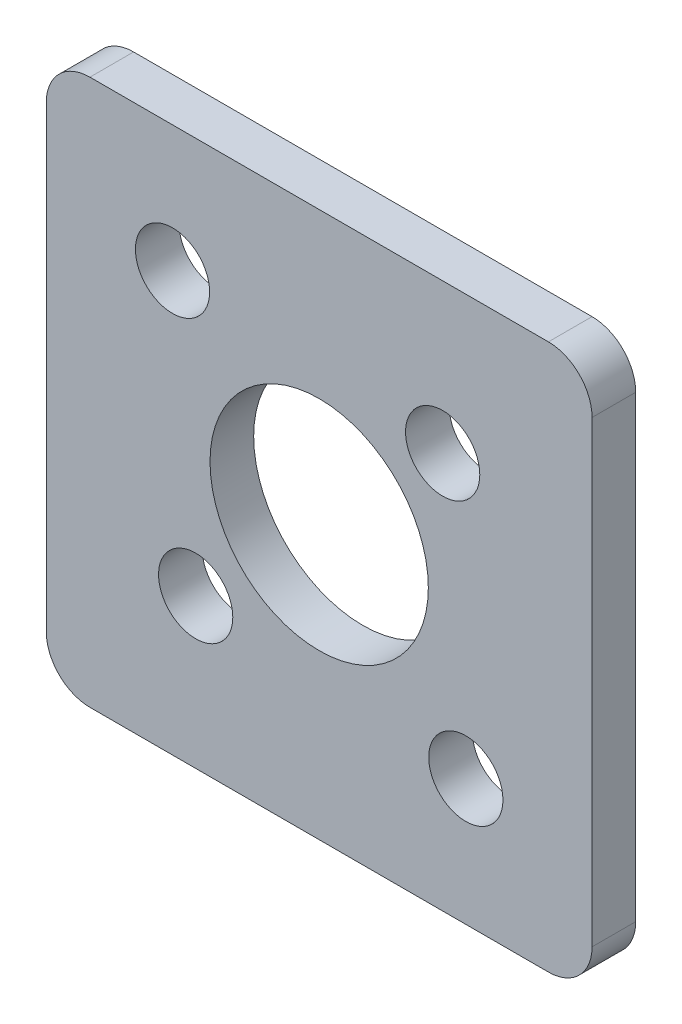
ISO-10303-21;
HEADER;
FILE_DESCRIPTION(('STEP AP214'),'2;1');
FILE_NAME('part.step','',(''),(''),'','','');
FILE_SCHEMA(('AUTOMOTIVE_DESIGN { 1 0 10303 214 1 1 1 1 }'));
ENDSEC;
DATA;
#1=APPLICATION_CONTEXT('core data for automotive mechanical design processes');
#2=APPLICATION_PROTOCOL_DEFINITION('international standard','automotive_design',2000,#1);
#3=PRODUCT_CONTEXT('',#1,'mechanical');
#4=PRODUCT('Part','Part','',(#3));
#5=PRODUCT_RELATED_PRODUCT_CATEGORY('part','',(#4));
#6=PRODUCT_DEFINITION_FORMATION('','',#4);
#7=PRODUCT_DEFINITION_CONTEXT('part definition',#1,'design');
#8=PRODUCT_DEFINITION('design','',#6,#7);
#9=PRODUCT_DEFINITION_SHAPE('','',#8);
#10=(LENGTH_UNIT() NAMED_UNIT(*) SI_UNIT(.MILLI.,.METRE.));
#11=(NAMED_UNIT(*) PLANE_ANGLE_UNIT() SI_UNIT($,.RADIAN.));
#12=(NAMED_UNIT(*) SI_UNIT($,.STERADIAN.) SOLID_ANGLE_UNIT());
#13=UNCERTAINTY_MEASURE_WITH_UNIT(LENGTH_MEASURE(1.E-05),#10,'distance_accuracy_value','');
#14=(GEOMETRIC_REPRESENTATION_CONTEXT(3) GLOBAL_UNCERTAINTY_ASSIGNED_CONTEXT((#13)) GLOBAL_UNIT_ASSIGNED_CONTEXT((#10,
#11,#12)) REPRESENTATION_CONTEXT('',''));
#15=CARTESIAN_POINT('',(0.,0.,0.));
#16=DIRECTION('',(0.,0.,1.));
#17=DIRECTION('',(1.,0.,0.));
#18=AXIS2_PLACEMENT_3D('',#15,#16,#17);
#19=CARTESIAN_POINT('',(0.,0.,2.));
#20=DIRECTION('',(0.,0.,-1.));
#21=DIRECTION('',(-1.,0.,0.));
#22=AXIS2_PLACEMENT_3D('',#19,#20,#21);
#23=PLANE('',#22);
#24=CARTESIAN_POINT('',(-6.7175144212722,6.71751442127219,2.));
#25=DIRECTION('',(0.,0.,1.));
#26=DIRECTION('',(1.,0.,0.));
#27=AXIS2_PLACEMENT_3D('',#24,#25,#26);
#28=CIRCLE('',#27,1.7);
#29=CARTESIAN_POINT('',(-5.0175144212722,6.71751442127219,2.));
#30=VERTEX_POINT('',#29);
#31=EDGE_CURVE('E205',#30,#30,#28,.T.);
#32=ORIENTED_EDGE('',*,*,#31,.F.);
#33=EDGE_LOOP('',(#32));
#34=FACE_BOUND('',#33,.T.);
#35=CARTESIAN_POINT('',(5.65685424949238,5.65685424949238,2.));
#36=DIRECTION('',(0.,0.,1.));
#37=DIRECTION('',(1.,0.,0.));
#38=AXIS2_PLACEMENT_3D('',#35,#36,#37);
#39=CIRCLE('',#38,1.7);
#40=CARTESIAN_POINT('',(7.35685424949238,5.65685424949238,2.));
#41=VERTEX_POINT('',#40);
#42=EDGE_CURVE('E199',#41,#41,#39,.T.);
#43=ORIENTED_EDGE('',*,*,#42,.F.);
#44=EDGE_LOOP('',(#43));
#45=FACE_BOUND('',#44,.T.);
#46=CARTESIAN_POINT('',(6.7175144212722,-6.7175144212722,2.));
#47=DIRECTION('',(0.,0.,1.));
#48=DIRECTION('',(1.,0.,0.));
#49=AXIS2_PLACEMENT_3D('',#46,#47,#48);
#50=CIRCLE('',#49,1.7);
#51=CARTESIAN_POINT('',(8.41751442127219,-6.7175144212722,2.));
#52=VERTEX_POINT('',#51);
#53=EDGE_CURVE('E193',#52,#52,#50,.T.);
#54=ORIENTED_EDGE('',*,*,#53,.F.);
#55=EDGE_LOOP('',(#54));
#56=FACE_BOUND('',#55,.T.);
#57=CARTESIAN_POINT('',(-5.65685424949238,-5.65685424949238,2.));
#58=DIRECTION('',(0.,0.,1.));
#59=DIRECTION('',(1.,0.,0.));
#60=AXIS2_PLACEMENT_3D('',#57,#58,#59);
#61=CIRCLE('',#60,1.7);
#62=CARTESIAN_POINT('',(-3.95685424949239,-5.65685424949238,2.));
#63=VERTEX_POINT('',#62);
#64=EDGE_CURVE('E187',#63,#63,#61,.T.);
#65=ORIENTED_EDGE('',*,*,#64,.F.);
#66=EDGE_LOOP('',(#65));
#67=FACE_BOUND('',#66,.T.);
#68=DIRECTION('',(1.,0.,0.));
#69=VECTOR('',#68,1.);
#70=CARTESIAN_POINT('',(-12.5,-12.5,2.));
#71=LINE('',#70,#69);
#72=CARTESIAN_POINT('',(-10.5,-12.5,2.));
#73=VERTEX_POINT('',#72);
#74=CARTESIAN_POINT('',(10.5,-12.5,2.));
#75=VERTEX_POINT('',#74);
#76=EDGE_CURVE('E169',#73,#75,#71,.T.);
#77=ORIENTED_EDGE('',*,*,#76,.T.);
#78=CARTESIAN_POINT('',(10.5,-10.5,2.));
#79=DIRECTION('',(0.,0.,-1.));
#80=DIRECTION('',(-1.,0.,0.));
#81=AXIS2_PLACEMENT_3D('',#78,#79,#80);
#82=CIRCLE('',#81,2.);
#83=CARTESIAN_POINT('',(12.5,-10.5,2.));
#84=VERTEX_POINT('',#83);
#85=EDGE_CURVE('E147',#75,#84,#82,.F.);
#86=ORIENTED_EDGE('',*,*,#85,.T.);
#87=DIRECTION('',(0.,1.,0.));
#88=VECTOR('',#87,1.);
#89=CARTESIAN_POINT('',(12.5,-12.5,2.));
#90=LINE('',#89,#88);
#91=CARTESIAN_POINT('',(12.5,10.5,2.));
#92=VERTEX_POINT('',#91);
#93=EDGE_CURVE('E117',#84,#92,#90,.T.);
#94=ORIENTED_EDGE('',*,*,#93,.T.);
#95=CARTESIAN_POINT('',(10.5,10.5,2.));
#96=DIRECTION('',(0.,0.,-1.));
#97=DIRECTION('',(-1.,0.,0.));
#98=AXIS2_PLACEMENT_3D('',#95,#96,#97);
#99=CIRCLE('',#98,2.);
#100=CARTESIAN_POINT('',(10.5,12.5,2.));
#101=VERTEX_POINT('',#100);
#102=EDGE_CURVE('E53',#92,#101,#99,.F.);
#103=ORIENTED_EDGE('',*,*,#102,.T.);
#104=DIRECTION('',(-1.,0.,0.));
#105=VECTOR('',#104,1.);
#106=CARTESIAN_POINT('',(-12.5,12.5,2.));
#107=LINE('',#106,#105);
#108=CARTESIAN_POINT('',(-10.5,12.5,2.));
#109=VERTEX_POINT('',#108);
#110=EDGE_CURVE('E133',#101,#109,#107,.T.);
#111=ORIENTED_EDGE('',*,*,#110,.T.);
#112=CARTESIAN_POINT('',(-10.5,10.5,2.));
#113=DIRECTION('',(0.,0.,-1.));
#114=DIRECTION('',(-1.,0.,0.));
#115=AXIS2_PLACEMENT_3D('',#112,#113,#114);
#116=CIRCLE('',#115,2.);
#117=CARTESIAN_POINT('',(-12.5,10.5,2.));
#118=VERTEX_POINT('',#117);
#119=EDGE_CURVE('E143',#109,#118,#116,.F.);
#120=ORIENTED_EDGE('',*,*,#119,.T.);
#121=DIRECTION('',(0.,-1.,0.));
#122=VECTOR('',#121,1.);
#123=CARTESIAN_POINT('',(-12.5,-12.5,2.));
#124=LINE('',#123,#122);
#125=CARTESIAN_POINT('',(-12.5,-10.5,2.));
#126=VERTEX_POINT('',#125);
#127=EDGE_CURVE('E127',#118,#126,#124,.T.);
#128=ORIENTED_EDGE('',*,*,#127,.T.);
#129=CARTESIAN_POINT('',(-10.5,-10.5,2.));
#130=DIRECTION('',(0.,0.,-1.));
#131=DIRECTION('',(-1.,0.,0.));
#132=AXIS2_PLACEMENT_3D('',#129,#130,#131);
#133=CIRCLE('',#132,2.);
#134=EDGE_CURVE('E145',#126,#73,#133,.F.);
#135=ORIENTED_EDGE('',*,*,#134,.T.);
#136=EDGE_LOOP('',(#77,#86,#94,#103,#111,#120,#128,#135));
#137=FACE_BOUND('',#136,.T.);
#138=CARTESIAN_POINT('',(0.,0.,2.));
#139=DIRECTION('',(0.,0.,1.));
#140=DIRECTION('',(1.,0.,0.));
#141=AXIS2_PLACEMENT_3D('',#138,#139,#140);
#142=CIRCLE('',#141,5.);
#143=CARTESIAN_POINT('',(5.,0.,2.));
#144=VERTEX_POINT('',#143);
#145=EDGE_CURVE('E178',#144,#144,#142,.T.);
#146=ORIENTED_EDGE('',*,*,#145,.F.);
#147=EDGE_LOOP('',(#146));
#148=FACE_BOUND('',#147,.T.);
#149=ADVANCED_FACE('F33',(#34,#45,#56,#67,#137,#148),#23,.F.);
#150=CARTESIAN_POINT('',(0.,0.,0.));
#151=DIRECTION('',(0.,0.,-1.));
#152=DIRECTION('',(-1.,0.,0.));
#153=AXIS2_PLACEMENT_3D('',#150,#151,#152);
#154=PLANE('',#153);
#155=CARTESIAN_POINT('',(-6.7175144212722,6.71751442127219,0.));
#156=DIRECTION('',(0.,0.,1.));
#157=DIRECTION('',(1.,0.,0.));
#158=AXIS2_PLACEMENT_3D('',#155,#156,#157);
#159=CIRCLE('',#158,1.7);
#160=CARTESIAN_POINT('',(-5.0175144212722,6.71751442127219,0.));
#161=VERTEX_POINT('',#160);
#162=EDGE_CURVE('E202',#161,#161,#159,.T.);
#163=ORIENTED_EDGE('',*,*,#162,.T.);
#164=EDGE_LOOP('',(#163));
#165=FACE_BOUND('',#164,.T.);
#166=CARTESIAN_POINT('',(5.65685424949238,5.65685424949238,0.));
#167=DIRECTION('',(0.,0.,1.));
#168=DIRECTION('',(1.,0.,0.));
#169=AXIS2_PLACEMENT_3D('',#166,#167,#168);
#170=CIRCLE('',#169,1.7);
#171=CARTESIAN_POINT('',(7.35685424949238,5.65685424949238,0.));
#172=VERTEX_POINT('',#171);
#173=EDGE_CURVE('E196',#172,#172,#170,.T.);
#174=ORIENTED_EDGE('',*,*,#173,.T.);
#175=EDGE_LOOP('',(#174));
#176=FACE_BOUND('',#175,.T.);
#177=CARTESIAN_POINT('',(6.7175144212722,-6.7175144212722,0.));
#178=DIRECTION('',(0.,0.,1.));
#179=DIRECTION('',(1.,0.,0.));
#180=AXIS2_PLACEMENT_3D('',#177,#178,#179);
#181=CIRCLE('',#180,1.7);
#182=CARTESIAN_POINT('',(8.41751442127219,-6.7175144212722,0.));
#183=VERTEX_POINT('',#182);
#184=EDGE_CURVE('E190',#183,#183,#181,.T.);
#185=ORIENTED_EDGE('',*,*,#184,.T.);
#186=EDGE_LOOP('',(#185));
#187=FACE_BOUND('',#186,.T.);
#188=CARTESIAN_POINT('',(-5.65685424949238,-5.65685424949238,0.));
#189=DIRECTION('',(0.,0.,1.));
#190=DIRECTION('',(1.,0.,0.));
#191=AXIS2_PLACEMENT_3D('',#188,#189,#190);
#192=CIRCLE('',#191,1.7);
#193=CARTESIAN_POINT('',(-3.95685424949239,-5.65685424949238,0.));
#194=VERTEX_POINT('',#193);
#195=EDGE_CURVE('E183',#194,#194,#192,.T.);
#196=ORIENTED_EDGE('',*,*,#195,.T.);
#197=EDGE_LOOP('',(#196));
#198=FACE_BOUND('',#197,.T.);
#199=DIRECTION('',(0.,1.,0.));
#200=VECTOR('',#199,1.);
#201=CARTESIAN_POINT('',(12.5,-12.5,0.));
#202=LINE('',#201,#200);
#203=CARTESIAN_POINT('',(12.5,-10.5,0.));
#204=VERTEX_POINT('',#203);
#205=CARTESIAN_POINT('',(12.5,10.5,0.));
#206=VERTEX_POINT('',#205);
#207=EDGE_CURVE('E115',#204,#206,#202,.T.);
#208=ORIENTED_EDGE('',*,*,#207,.F.);
#209=CARTESIAN_POINT('',(10.5,-10.5,0.));
#210=DIRECTION('',(0.,0.,-1.));
#211=DIRECTION('',(-1.,0.,0.));
#212=AXIS2_PLACEMENT_3D('',#209,#210,#211);
#213=CIRCLE('',#212,2.);
#214=CARTESIAN_POINT('',(10.5,-12.5,0.));
#215=VERTEX_POINT('',#214);
#216=EDGE_CURVE('E98',#204,#215,#213,.T.);
#217=ORIENTED_EDGE('',*,*,#216,.T.);
#218=DIRECTION('',(1.,0.,0.));
#219=VECTOR('',#218,1.);
#220=CARTESIAN_POINT('',(-12.5,-12.5,0.));
#221=LINE('',#220,#219);
#222=CARTESIAN_POINT('',(-10.5,-12.5,0.));
#223=VERTEX_POINT('',#222);
#224=EDGE_CURVE('E125',#223,#215,#221,.T.);
#225=ORIENTED_EDGE('',*,*,#224,.F.);
#226=CARTESIAN_POINT('',(-10.5,-10.5,0.));
#227=DIRECTION('',(0.,0.,-1.));
#228=DIRECTION('',(-1.,0.,0.));
#229=AXIS2_PLACEMENT_3D('',#226,#227,#228);
#230=CIRCLE('',#229,2.);
#231=CARTESIAN_POINT('',(-12.5,-10.5,0.));
#232=VERTEX_POINT('',#231);
#233=EDGE_CURVE('E109',#223,#232,#230,.T.);
#234=ORIENTED_EDGE('',*,*,#233,.T.);
#235=DIRECTION('',(0.,-1.,0.));
#236=VECTOR('',#235,1.);
#237=CARTESIAN_POINT('',(-12.5,-12.5,0.));
#238=LINE('',#237,#236);
#239=CARTESIAN_POINT('',(-12.5,10.5,0.));
#240=VERTEX_POINT('',#239);
#241=EDGE_CURVE('E129',#240,#232,#238,.T.);
#242=ORIENTED_EDGE('',*,*,#241,.F.);
#243=CARTESIAN_POINT('',(-10.5,10.5,0.));
#244=DIRECTION('',(0.,0.,-1.));
#245=DIRECTION('',(-1.,0.,0.));
#246=AXIS2_PLACEMENT_3D('',#243,#244,#245);
#247=CIRCLE('',#246,2.);
#248=CARTESIAN_POINT('',(-10.5,12.5,0.));
#249=VERTEX_POINT('',#248);
#250=EDGE_CURVE('E136',#240,#249,#247,.T.);
#251=ORIENTED_EDGE('',*,*,#250,.T.);
#252=DIRECTION('',(-1.,0.,0.));
#253=VECTOR('',#252,1.);
#254=CARTESIAN_POINT('',(-12.5,12.5,0.));
#255=LINE('',#254,#253);
#256=CARTESIAN_POINT('',(10.5,12.5,0.));
#257=VERTEX_POINT('',#256);
#258=EDGE_CURVE('E124',#257,#249,#255,.T.);
#259=ORIENTED_EDGE('',*,*,#258,.F.);
#260=CARTESIAN_POINT('',(10.5,10.5,0.));
#261=DIRECTION('',(0.,0.,-1.));
#262=DIRECTION('',(-1.,0.,0.));
#263=AXIS2_PLACEMENT_3D('',#260,#261,#262);
#264=CIRCLE('',#263,2.);
#265=EDGE_CURVE('E118',#257,#206,#264,.T.);
#266=ORIENTED_EDGE('',*,*,#265,.T.);
#267=EDGE_LOOP('',(#208,#217,#225,#234,#242,#251,#259,#266));
#268=FACE_BOUND('',#267,.T.);
#269=CARTESIAN_POINT('',(0.,0.,0.));
#270=DIRECTION('',(0.,0.,1.));
#271=DIRECTION('',(1.,0.,0.));
#272=AXIS2_PLACEMENT_3D('',#269,#270,#271);
#273=CIRCLE('',#272,5.);
#274=CARTESIAN_POINT('',(5.,0.,0.));
#275=VERTEX_POINT('',#274);
#276=EDGE_CURVE('E174',#275,#275,#273,.T.);
#277=ORIENTED_EDGE('',*,*,#276,.T.);
#278=EDGE_LOOP('',(#277));
#279=FACE_BOUND('',#278,.T.);
#280=ADVANCED_FACE('F121',(#165,#176,#187,#198,#268,#279),#154,.T.);
#281=CARTESIAN_POINT('',(-12.5,-12.5,2.));
#282=DIRECTION('',(1.,0.,0.));
#283=DIRECTION('',(0.,1.,0.));
#284=AXIS2_PLACEMENT_3D('',#281,#282,#283);
#285=PLANE('',#284);
#286=ORIENTED_EDGE('',*,*,#241,.T.);
#287=DIRECTION('',(0.,0.,-1.));
#288=VECTOR('',#287,1.);
#289=CARTESIAN_POINT('',(-12.5,-10.5,2.));
#290=LINE('',#289,#288);
#291=EDGE_CURVE('E152',#232,#126,#290,.F.);
#292=ORIENTED_EDGE('',*,*,#291,.T.);
#293=ORIENTED_EDGE('',*,*,#127,.F.);
#294=DIRECTION('',(0.,0.,-1.));
#295=VECTOR('',#294,1.);
#296=CARTESIAN_POINT('',(-12.5,10.5,2.));
#297=LINE('',#296,#295);
#298=EDGE_CURVE('E149',#118,#240,#297,.T.);
#299=ORIENTED_EDGE('',*,*,#298,.T.);
#300=EDGE_LOOP('',(#286,#292,#293,#299));
#301=FACE_BOUND('',#300,.T.);
#302=ADVANCED_FACE('F165',(#301),#285,.F.);
#303=CARTESIAN_POINT('',(-12.5,-12.5,2.));
#304=DIRECTION('',(0.,1.,0.));
#305=DIRECTION('',(0.,0.,1.));
#306=AXIS2_PLACEMENT_3D('',#303,#304,#305);
#307=PLANE('',#306);
#308=ORIENTED_EDGE('',*,*,#224,.T.);
#309=DIRECTION('',(0.,0.,-1.));
#310=VECTOR('',#309,1.);
#311=CARTESIAN_POINT('',(10.5,-12.5,2.));
#312=LINE('',#311,#310);
#313=EDGE_CURVE('E103',#215,#75,#312,.F.);
#314=ORIENTED_EDGE('',*,*,#313,.T.);
#315=ORIENTED_EDGE('',*,*,#76,.F.);
#316=DIRECTION('',(0.,0.,-1.));
#317=VECTOR('',#316,1.);
#318=CARTESIAN_POINT('',(-10.5,-12.5,2.));
#319=LINE('',#318,#317);
#320=EDGE_CURVE('E108',#73,#223,#319,.T.);
#321=ORIENTED_EDGE('',*,*,#320,.T.);
#322=EDGE_LOOP('',(#308,#314,#315,#321));
#323=FACE_BOUND('',#322,.T.);
#324=ADVANCED_FACE('F223',(#323),#307,.F.);
#325=CARTESIAN_POINT('',(12.5,-12.5,2.));
#326=DIRECTION('',(-1.,0.,0.));
#327=DIRECTION('',(0.,-1.,0.));
#328=AXIS2_PLACEMENT_3D('',#325,#326,#327);
#329=PLANE('',#328);
#330=ORIENTED_EDGE('',*,*,#93,.F.);
#331=DIRECTION('',(0.,0.,-1.));
#332=VECTOR('',#331,1.);
#333=CARTESIAN_POINT('',(12.5,-10.5,2.));
#334=LINE('',#333,#332);
#335=EDGE_CURVE('E102',#84,#204,#334,.T.);
#336=ORIENTED_EDGE('',*,*,#335,.T.);
#337=ORIENTED_EDGE('',*,*,#207,.T.);
#338=DIRECTION('',(0.,0.,-1.));
#339=VECTOR('',#338,1.);
#340=CARTESIAN_POINT('',(12.5,10.5,2.));
#341=LINE('',#340,#339);
#342=EDGE_CURVE('E119',#206,#92,#341,.F.);
#343=ORIENTED_EDGE('',*,*,#342,.T.);
#344=EDGE_LOOP('',(#330,#336,#337,#343));
#345=FACE_BOUND('',#344,.T.);
#346=ADVANCED_FACE('F114',(#345),#329,.F.);
#347=CARTESIAN_POINT('',(-12.5,12.5,2.));
#348=DIRECTION('',(0.,-1.,0.));
#349=DIRECTION('',(0.,0.,-1.));
#350=AXIS2_PLACEMENT_3D('',#347,#348,#349);
#351=PLANE('',#350);
#352=ORIENTED_EDGE('',*,*,#258,.T.);
#353=DIRECTION('',(0.,0.,-1.));
#354=VECTOR('',#353,1.);
#355=CARTESIAN_POINT('',(-10.5,12.5,2.));
#356=LINE('',#355,#354);
#357=EDGE_CURVE('E11',#249,#109,#356,.F.);
#358=ORIENTED_EDGE('',*,*,#357,.T.);
#359=ORIENTED_EDGE('',*,*,#110,.F.);
#360=DIRECTION('',(0.,0.,-1.));
#361=VECTOR('',#360,1.);
#362=CARTESIAN_POINT('',(10.5,12.5,2.));
#363=LINE('',#362,#361);
#364=EDGE_CURVE('E41',#101,#257,#363,.T.);
#365=ORIENTED_EDGE('',*,*,#364,.T.);
#366=EDGE_LOOP('',(#352,#358,#359,#365));
#367=FACE_BOUND('',#366,.T.);
#368=ADVANCED_FACE('F155',(#367),#351,.F.);
#369=CARTESIAN_POINT('',(0.,0.,2.));
#370=DIRECTION('',(0.,0.,-1.));
#371=DIRECTION('',(-1.,0.,0.));
#372=AXIS2_PLACEMENT_3D('',#369,#370,#371);
#373=CYLINDRICAL_SURFACE('',#372,5.);
#374=ORIENTED_EDGE('',*,*,#145,.T.);
#375=EDGE_LOOP('',(#374));
#376=FACE_BOUND('',#375,.T.);
#377=ORIENTED_EDGE('',*,*,#276,.F.);
#378=EDGE_LOOP('',(#377));
#379=FACE_BOUND('',#378,.T.);
#380=ADVANCED_FACE('F232',(#376,#379),#373,.F.);
#381=CARTESIAN_POINT('',(10.5,-10.5,2.));
#382=DIRECTION('',(0.,0.,-1.));
#383=DIRECTION('',(-1.,0.,0.));
#384=AXIS2_PLACEMENT_3D('',#381,#382,#383);
#385=CYLINDRICAL_SURFACE('',#384,2.);
#386=ORIENTED_EDGE('',*,*,#85,.F.);
#387=ORIENTED_EDGE('',*,*,#313,.F.);
#388=ORIENTED_EDGE('',*,*,#216,.F.);
#389=ORIENTED_EDGE('',*,*,#335,.F.);
#390=EDGE_LOOP('',(#386,#387,#388,#389));
#391=FACE_BOUND('',#390,.T.);
#392=ADVANCED_FACE('F101',(#391),#385,.T.);
#393=CARTESIAN_POINT('',(-10.5,-10.5,2.));
#394=DIRECTION('',(0.,0.,-1.));
#395=DIRECTION('',(-1.,0.,0.));
#396=AXIS2_PLACEMENT_3D('',#393,#394,#395);
#397=CYLINDRICAL_SURFACE('',#396,2.);
#398=ORIENTED_EDGE('',*,*,#134,.F.);
#399=ORIENTED_EDGE('',*,*,#291,.F.);
#400=ORIENTED_EDGE('',*,*,#233,.F.);
#401=ORIENTED_EDGE('',*,*,#320,.F.);
#402=EDGE_LOOP('',(#398,#399,#400,#401));
#403=FACE_BOUND('',#402,.T.);
#404=ADVANCED_FACE('F225',(#403),#397,.T.);
#405=CARTESIAN_POINT('',(-10.5,10.5,2.));
#406=DIRECTION('',(0.,0.,-1.));
#407=DIRECTION('',(-1.,0.,0.));
#408=AXIS2_PLACEMENT_3D('',#405,#406,#407);
#409=CYLINDRICAL_SURFACE('',#408,2.);
#410=ORIENTED_EDGE('',*,*,#119,.F.);
#411=ORIENTED_EDGE('',*,*,#357,.F.);
#412=ORIENTED_EDGE('',*,*,#250,.F.);
#413=ORIENTED_EDGE('',*,*,#298,.F.);
#414=EDGE_LOOP('',(#410,#411,#412,#413));
#415=FACE_BOUND('',#414,.T.);
#416=ADVANCED_FACE('F162',(#415),#409,.T.);
#417=CARTESIAN_POINT('',(10.5,10.5,2.));
#418=DIRECTION('',(0.,0.,-1.));
#419=DIRECTION('',(-1.,0.,0.));
#420=AXIS2_PLACEMENT_3D('',#417,#418,#419);
#421=CYLINDRICAL_SURFACE('',#420,2.);
#422=ORIENTED_EDGE('',*,*,#102,.F.);
#423=ORIENTED_EDGE('',*,*,#342,.F.);
#424=ORIENTED_EDGE('',*,*,#265,.F.);
#425=ORIENTED_EDGE('',*,*,#364,.F.);
#426=EDGE_LOOP('',(#422,#423,#424,#425));
#427=FACE_BOUND('',#426,.T.);
#428=ADVANCED_FACE('F35',(#427),#421,.T.);
#429=CARTESIAN_POINT('',(-5.65685424949238,-5.65685424949238,2.));
#430=DIRECTION('',(0.,0.,1.));
#431=DIRECTION('',(1.,0.,0.));
#432=AXIS2_PLACEMENT_3D('',#429,#430,#431);
#433=CYLINDRICAL_SURFACE('',#432,1.7);
#434=ORIENTED_EDGE('',*,*,#195,.F.);
#435=EDGE_LOOP('',(#434));
#436=FACE_BOUND('',#435,.T.);
#437=ORIENTED_EDGE('',*,*,#64,.T.);
#438=EDGE_LOOP('',(#437));
#439=FACE_BOUND('',#438,.T.);
#440=ADVANCED_FACE('F248',(#436,#439),#433,.F.);
#441=CARTESIAN_POINT('',(6.7175144212722,-6.7175144212722,2.));
#442=DIRECTION('',(0.,0.,1.));
#443=DIRECTION('',(1.,0.,0.));
#444=AXIS2_PLACEMENT_3D('',#441,#442,#443);
#445=CYLINDRICAL_SURFACE('',#444,1.7);
#446=ORIENTED_EDGE('',*,*,#184,.F.);
#447=EDGE_LOOP('',(#446));
#448=FACE_BOUND('',#447,.T.);
#449=ORIENTED_EDGE('',*,*,#53,.T.);
#450=EDGE_LOOP('',(#449));
#451=FACE_BOUND('',#450,.T.);
#452=ADVANCED_FACE('F251',(#448,#451),#445,.F.);
#453=CARTESIAN_POINT('',(5.65685424949238,5.65685424949238,2.));
#454=DIRECTION('',(0.,0.,1.));
#455=DIRECTION('',(1.,0.,0.));
#456=AXIS2_PLACEMENT_3D('',#453,#454,#455);
#457=CYLINDRICAL_SURFACE('',#456,1.7);
#458=ORIENTED_EDGE('',*,*,#173,.F.);
#459=EDGE_LOOP('',(#458));
#460=FACE_BOUND('',#459,.T.);
#461=ORIENTED_EDGE('',*,*,#42,.T.);
#462=EDGE_LOOP('',(#461));
#463=FACE_BOUND('',#462,.T.);
#464=ADVANCED_FACE('F255',(#460,#463),#457,.F.);
#465=CARTESIAN_POINT('',(-6.7175144212722,6.71751442127219,2.));
#466=DIRECTION('',(0.,0.,1.));
#467=DIRECTION('',(1.,0.,0.));
#468=AXIS2_PLACEMENT_3D('',#465,#466,#467);
#469=CYLINDRICAL_SURFACE('',#468,1.7);
#470=ORIENTED_EDGE('',*,*,#162,.F.);
#471=EDGE_LOOP('',(#470));
#472=FACE_BOUND('',#471,.T.);
#473=ORIENTED_EDGE('',*,*,#31,.T.);
#474=EDGE_LOOP('',(#473));
#475=FACE_BOUND('',#474,.T.);
#476=ADVANCED_FACE('F209',(#472,#475),#469,.F.);
#477=CLOSED_SHELL('',(#149,#280,#302,#324,#346,#368,#380,#392,#404,#416,#428,#440,#452,#464,#476));
#478=MANIFOLD_SOLID_BREP('B2',#477);
#479=ADVANCED_BREP_SHAPE_REPRESENTATION('',(#18,#478),#14);
#480=SHAPE_DEFINITION_REPRESENTATION(#9,#479);
ENDSEC;
END-ISO-10303-21;
